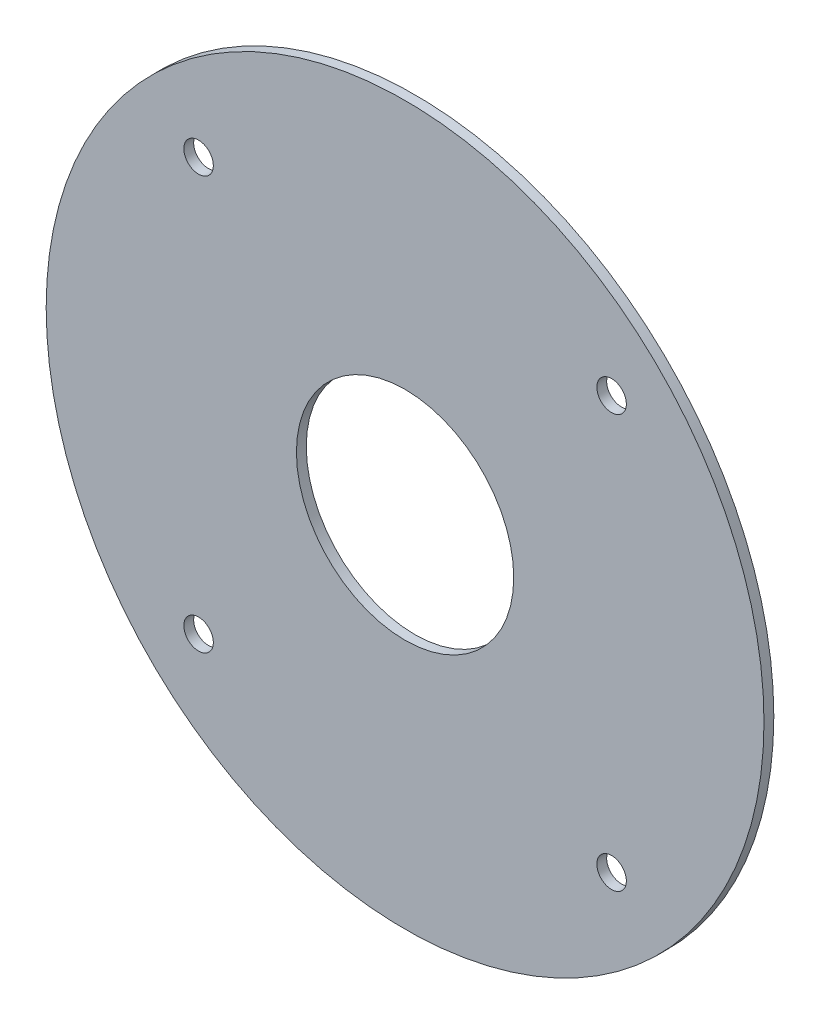
ISO-10303-21;
HEADER;
FILE_DESCRIPTION(('STEP AP214'),'2;1');
FILE_NAME('part.step','',(''),(''),'','','');
FILE_SCHEMA(('AUTOMOTIVE_DESIGN { 1 0 10303 214 1 1 1 1 }'));
ENDSEC;
DATA;
#1=APPLICATION_CONTEXT('core data for automotive mechanical design processes');
#2=APPLICATION_PROTOCOL_DEFINITION('international standard','automotive_design',2000,#1);
#3=PRODUCT_CONTEXT('',#1,'mechanical');
#4=PRODUCT('Part','Part','',(#3));
#5=PRODUCT_RELATED_PRODUCT_CATEGORY('part','',(#4));
#6=PRODUCT_DEFINITION_FORMATION('','',#4);
#7=PRODUCT_DEFINITION_CONTEXT('part definition',#1,'design');
#8=PRODUCT_DEFINITION('design','',#6,#7);
#9=PRODUCT_DEFINITION_SHAPE('','',#8);
#10=(LENGTH_UNIT() NAMED_UNIT(*) SI_UNIT(.MILLI.,.METRE.));
#11=(NAMED_UNIT(*) PLANE_ANGLE_UNIT() SI_UNIT($,.RADIAN.));
#12=(NAMED_UNIT(*) SI_UNIT($,.STERADIAN.) SOLID_ANGLE_UNIT());
#13=UNCERTAINTY_MEASURE_WITH_UNIT(LENGTH_MEASURE(1.E-05),#10,'distance_accuracy_value','');
#14=(GEOMETRIC_REPRESENTATION_CONTEXT(3) GLOBAL_UNCERTAINTY_ASSIGNED_CONTEXT((#13)) GLOBAL_UNIT_ASSIGNED_CONTEXT((#10,
#11,#12)) REPRESENTATION_CONTEXT('',''));
#15=CARTESIAN_POINT('',(0.,0.,0.));
#16=DIRECTION('',(0.,0.,1.));
#17=DIRECTION('',(1.,0.,0.));
#18=AXIS2_PLACEMENT_3D('',#15,#16,#17);
#19=CARTESIAN_POINT('',(-96.0797491728807,-54.7637146412523,1.));
#20=DIRECTION('',(0.,0.,-1.));
#21=DIRECTION('',(-1.,0.,0.));
#22=AXIS2_PLACEMENT_3D('',#19,#20,#21);
#23=CYLINDRICAL_SURFACE('',#22,11.05);
#24=CARTESIAN_POINT('',(-96.0797491728807,-54.7637146412523,1.));
#25=DIRECTION('',(0.,0.,1.));
#26=DIRECTION('',(1.,0.,0.));
#27=AXIS2_PLACEMENT_3D('',#24,#25,#26);
#28=CIRCLE('',#27,11.05);
#29=CARTESIAN_POINT('',(-85.0297491728807,-54.7637146412523,1.));
#30=VERTEX_POINT('',#29);
#31=EDGE_CURVE('E47',#30,#30,#28,.T.);
#32=ORIENTED_EDGE('',*,*,#31,.T.);
#33=EDGE_LOOP('',(#32));
#34=FACE_BOUND('',#33,.T.);
#35=CARTESIAN_POINT('',(-96.0797491728807,-54.7637146412523,0.));
#36=DIRECTION('',(0.,0.,1.));
#37=DIRECTION('',(1.,0.,0.));
#38=AXIS2_PLACEMENT_3D('',#35,#36,#37);
#39=CIRCLE('',#38,11.05);
#40=CARTESIAN_POINT('',(-85.0297491728807,-54.7637146412523,0.));
#41=VERTEX_POINT('',#40);
#42=EDGE_CURVE('E67',#41,#41,#39,.T.);
#43=ORIENTED_EDGE('',*,*,#42,.F.);
#44=EDGE_LOOP('',(#43));
#45=FACE_BOUND('',#44,.T.);
#46=ADVANCED_FACE('F39',(#34,#45),#23,.F.);
#47=CARTESIAN_POINT('',(-117.080820574121,-33.7626432400118,1.));
#48=DIRECTION('',(0.,0.,-1.));
#49=DIRECTION('',(-1.,0.,0.));
#50=AXIS2_PLACEMENT_3D('',#47,#48,#49);
#51=CYLINDRICAL_SURFACE('',#50,1.5);
#52=CARTESIAN_POINT('',(-117.080820574121,-33.7626432400118,1.));
#53=DIRECTION('',(0.,0.,1.));
#54=DIRECTION('',(1.,0.,0.));
#55=AXIS2_PLACEMENT_3D('',#52,#53,#54);
#56=CIRCLE('',#55,1.5);
#57=CARTESIAN_POINT('',(-115.580820574121,-33.7626432400118,1.));
#58=VERTEX_POINT('',#57);
#59=EDGE_CURVE('E52',#58,#58,#56,.T.);
#60=ORIENTED_EDGE('',*,*,#59,.T.);
#61=EDGE_LOOP('',(#60));
#62=FACE_BOUND('',#61,.T.);
#63=CARTESIAN_POINT('',(-117.080820574121,-33.7626432400118,0.));
#64=DIRECTION('',(0.,0.,1.));
#65=DIRECTION('',(1.,0.,0.));
#66=AXIS2_PLACEMENT_3D('',#63,#64,#65);
#67=CIRCLE('',#66,1.5);
#68=CARTESIAN_POINT('',(-115.580820574121,-33.7626432400118,0.));
#69=VERTEX_POINT('',#68);
#70=EDGE_CURVE('E65',#69,#69,#67,.T.);
#71=ORIENTED_EDGE('',*,*,#70,.F.);
#72=EDGE_LOOP('',(#71));
#73=FACE_BOUND('',#72,.T.);
#74=ADVANCED_FACE('F88',(#62,#73),#51,.F.);
#75=CARTESIAN_POINT('',(-117.080820574121,-75.7647860424927,1.));
#76=DIRECTION('',(0.,0.,-1.));
#77=DIRECTION('',(-1.,0.,0.));
#78=AXIS2_PLACEMENT_3D('',#75,#76,#77);
#79=CYLINDRICAL_SURFACE('',#78,1.5);
#80=CARTESIAN_POINT('',(-117.080820574121,-75.7647860424927,1.));
#81=DIRECTION('',(0.,0.,1.));
#82=DIRECTION('',(1.,0.,0.));
#83=AXIS2_PLACEMENT_3D('',#80,#81,#82);
#84=CIRCLE('',#83,1.5);
#85=CARTESIAN_POINT('',(-115.580820574121,-75.7647860424927,1.));
#86=VERTEX_POINT('',#85);
#87=EDGE_CURVE('E81',#86,#86,#84,.T.);
#88=ORIENTED_EDGE('',*,*,#87,.T.);
#89=EDGE_LOOP('',(#88));
#90=FACE_BOUND('',#89,.T.);
#91=CARTESIAN_POINT('',(-117.080820574121,-75.7647860424927,0.));
#92=DIRECTION('',(0.,0.,1.));
#93=DIRECTION('',(1.,0.,0.));
#94=AXIS2_PLACEMENT_3D('',#91,#92,#93);
#95=CIRCLE('',#94,1.5);
#96=CARTESIAN_POINT('',(-115.580820574121,-75.7647860424927,0.));
#97=VERTEX_POINT('',#96);
#98=EDGE_CURVE('E62',#97,#97,#95,.T.);
#99=ORIENTED_EDGE('',*,*,#98,.F.);
#100=EDGE_LOOP('',(#99));
#101=FACE_BOUND('',#100,.T.);
#102=ADVANCED_FACE('F106',(#90,#101),#79,.F.);
#103=CARTESIAN_POINT('',(-75.0786777716402,-75.7647860424927,1.));
#104=DIRECTION('',(0.,0.,-1.));
#105=DIRECTION('',(-1.,0.,0.));
#106=AXIS2_PLACEMENT_3D('',#103,#104,#105);
#107=CYLINDRICAL_SURFACE('',#106,1.5);
#108=CARTESIAN_POINT('',(-75.0786777716402,-75.7647860424927,1.));
#109=DIRECTION('',(0.,0.,1.));
#110=DIRECTION('',(1.,0.,0.));
#111=AXIS2_PLACEMENT_3D('',#108,#109,#110);
#112=CIRCLE('',#111,1.5);
#113=CARTESIAN_POINT('',(-73.5786777716402,-75.7647860424927,1.));
#114=VERTEX_POINT('',#113);
#115=EDGE_CURVE('E76',#114,#114,#112,.T.);
#116=ORIENTED_EDGE('',*,*,#115,.T.);
#117=EDGE_LOOP('',(#116));
#118=FACE_BOUND('',#117,.T.);
#119=CARTESIAN_POINT('',(-75.0786777716402,-75.7647860424927,0.));
#120=DIRECTION('',(0.,0.,1.));
#121=DIRECTION('',(1.,0.,0.));
#122=AXIS2_PLACEMENT_3D('',#119,#120,#121);
#123=CIRCLE('',#122,1.5);
#124=CARTESIAN_POINT('',(-73.5786777716402,-75.7647860424927,0.));
#125=VERTEX_POINT('',#124);
#126=EDGE_CURVE('E59',#125,#125,#123,.T.);
#127=ORIENTED_EDGE('',*,*,#126,.F.);
#128=EDGE_LOOP('',(#127));
#129=FACE_BOUND('',#128,.T.);
#130=ADVANCED_FACE('F112',(#118,#129),#107,.F.);
#131=CARTESIAN_POINT('',(-75.0786777716402,-33.7626432400118,1.));
#132=DIRECTION('',(0.,0.,-1.));
#133=DIRECTION('',(-1.,0.,0.));
#134=AXIS2_PLACEMENT_3D('',#131,#132,#133);
#135=CYLINDRICAL_SURFACE('',#134,1.5);
#136=CARTESIAN_POINT('',(-75.0786777716402,-33.7626432400118,1.));
#137=DIRECTION('',(0.,0.,1.));
#138=DIRECTION('',(1.,0.,0.));
#139=AXIS2_PLACEMENT_3D('',#136,#137,#138);
#140=CIRCLE('',#139,1.5);
#141=CARTESIAN_POINT('',(-73.5786777716402,-33.7626432400118,1.));
#142=VERTEX_POINT('',#141);
#143=EDGE_CURVE('E72',#142,#142,#140,.T.);
#144=ORIENTED_EDGE('',*,*,#143,.T.);
#145=EDGE_LOOP('',(#144));
#146=FACE_BOUND('',#145,.T.);
#147=CARTESIAN_POINT('',(-75.0786777716402,-33.7626432400118,0.));
#148=DIRECTION('',(0.,0.,1.));
#149=DIRECTION('',(1.,0.,0.));
#150=AXIS2_PLACEMENT_3D('',#147,#148,#149);
#151=CIRCLE('',#150,1.5);
#152=CARTESIAN_POINT('',(-73.5786777716402,-33.7626432400118,0.));
#153=VERTEX_POINT('',#152);
#154=EDGE_CURVE('E56',#153,#153,#151,.T.);
#155=ORIENTED_EDGE('',*,*,#154,.F.);
#156=EDGE_LOOP('',(#155));
#157=FACE_BOUND('',#156,.T.);
#158=ADVANCED_FACE('F41',(#146,#157),#135,.F.);
#159=CARTESIAN_POINT('',(-96.0797491728807,-54.7637146412523,1.));
#160=DIRECTION('',(0.,0.,-1.));
#161=DIRECTION('',(-1.,0.,0.));
#162=AXIS2_PLACEMENT_3D('',#159,#160,#161);
#163=CYLINDRICAL_SURFACE('',#162,36.5);
#164=CARTESIAN_POINT('',(-96.0797491728807,-54.7637146412523,1.));
#165=DIRECTION('',(0.,0.,1.));
#166=DIRECTION('',(1.,0.,0.));
#167=AXIS2_PLACEMENT_3D('',#164,#165,#166);
#168=CIRCLE('',#167,36.5);
#169=CARTESIAN_POINT('',(-59.5797491728807,-54.7637146412523,1.));
#170=VERTEX_POINT('',#169);
#171=EDGE_CURVE('E10',#170,#170,#168,.T.);
#172=ORIENTED_EDGE('',*,*,#171,.F.);
#173=EDGE_LOOP('',(#172));
#174=FACE_BOUND('',#173,.T.);
#175=CARTESIAN_POINT('',(-96.0797491728807,-54.7637146412523,0.));
#176=DIRECTION('',(0.,0.,1.));
#177=DIRECTION('',(1.,0.,0.));
#178=AXIS2_PLACEMENT_3D('',#175,#176,#177);
#179=CIRCLE('',#178,36.5);
#180=CARTESIAN_POINT('',(-59.5797491728807,-54.7637146412523,0.));
#181=VERTEX_POINT('',#180);
#182=EDGE_CURVE('E43',#181,#181,#179,.T.);
#183=ORIENTED_EDGE('',*,*,#182,.T.);
#184=EDGE_LOOP('',(#183));
#185=FACE_BOUND('',#184,.T.);
#186=ADVANCED_FACE('F95',(#174,#185),#163,.T.);
#187=CARTESIAN_POINT('',(0.,0.,1.));
#188=DIRECTION('',(0.,0.,1.));
#189=DIRECTION('',(1.,0.,0.));
#190=AXIS2_PLACEMENT_3D('',#187,#188,#189);
#191=PLANE('',#190);
#192=ORIENTED_EDGE('',*,*,#143,.F.);
#193=EDGE_LOOP('',(#192));
#194=FACE_BOUND('',#193,.T.);
#195=ORIENTED_EDGE('',*,*,#115,.F.);
#196=EDGE_LOOP('',(#195));
#197=FACE_BOUND('',#196,.T.);
#198=ORIENTED_EDGE('',*,*,#87,.F.);
#199=EDGE_LOOP('',(#198));
#200=FACE_BOUND('',#199,.T.);
#201=ORIENTED_EDGE('',*,*,#59,.F.);
#202=EDGE_LOOP('',(#201));
#203=FACE_BOUND('',#202,.T.);
#204=ORIENTED_EDGE('',*,*,#31,.F.);
#205=EDGE_LOOP('',(#204));
#206=FACE_BOUND('',#205,.T.);
#207=ORIENTED_EDGE('',*,*,#171,.T.);
#208=EDGE_LOOP('',(#207));
#209=FACE_BOUND('',#208,.T.);
#210=ADVANCED_FACE('F91',(#194,#197,#200,#203,#206,#209),#191,.T.);
#211=CARTESIAN_POINT('',(0.,0.,0.));
#212=DIRECTION('',(0.,0.,1.));
#213=DIRECTION('',(1.,0.,0.));
#214=AXIS2_PLACEMENT_3D('',#211,#212,#213);
#215=PLANE('',#214);
#216=ORIENTED_EDGE('',*,*,#154,.T.);
#217=EDGE_LOOP('',(#216));
#218=FACE_BOUND('',#217,.T.);
#219=ORIENTED_EDGE('',*,*,#126,.T.);
#220=EDGE_LOOP('',(#219));
#221=FACE_BOUND('',#220,.T.);
#222=ORIENTED_EDGE('',*,*,#98,.T.);
#223=EDGE_LOOP('',(#222));
#224=FACE_BOUND('',#223,.T.);
#225=ORIENTED_EDGE('',*,*,#70,.T.);
#226=EDGE_LOOP('',(#225));
#227=FACE_BOUND('',#226,.T.);
#228=ORIENTED_EDGE('',*,*,#42,.T.);
#229=EDGE_LOOP('',(#228));
#230=FACE_BOUND('',#229,.T.);
#231=ORIENTED_EDGE('',*,*,#182,.F.);
#232=EDGE_LOOP('',(#231));
#233=FACE_BOUND('',#232,.T.);
#234=ADVANCED_FACE('F94',(#218,#221,#224,#227,#230,#233),#215,.F.);
#235=CLOSED_SHELL('',(#46,#74,#102,#130,#158,#186,#210,#234));
#236=MANIFOLD_SOLID_BREP('B2',#235);
#237=ADVANCED_BREP_SHAPE_REPRESENTATION('',(#18,#236),#14);
#238=SHAPE_DEFINITION_REPRESENTATION(#9,#237);
ENDSEC;
END-ISO-10303-21;
